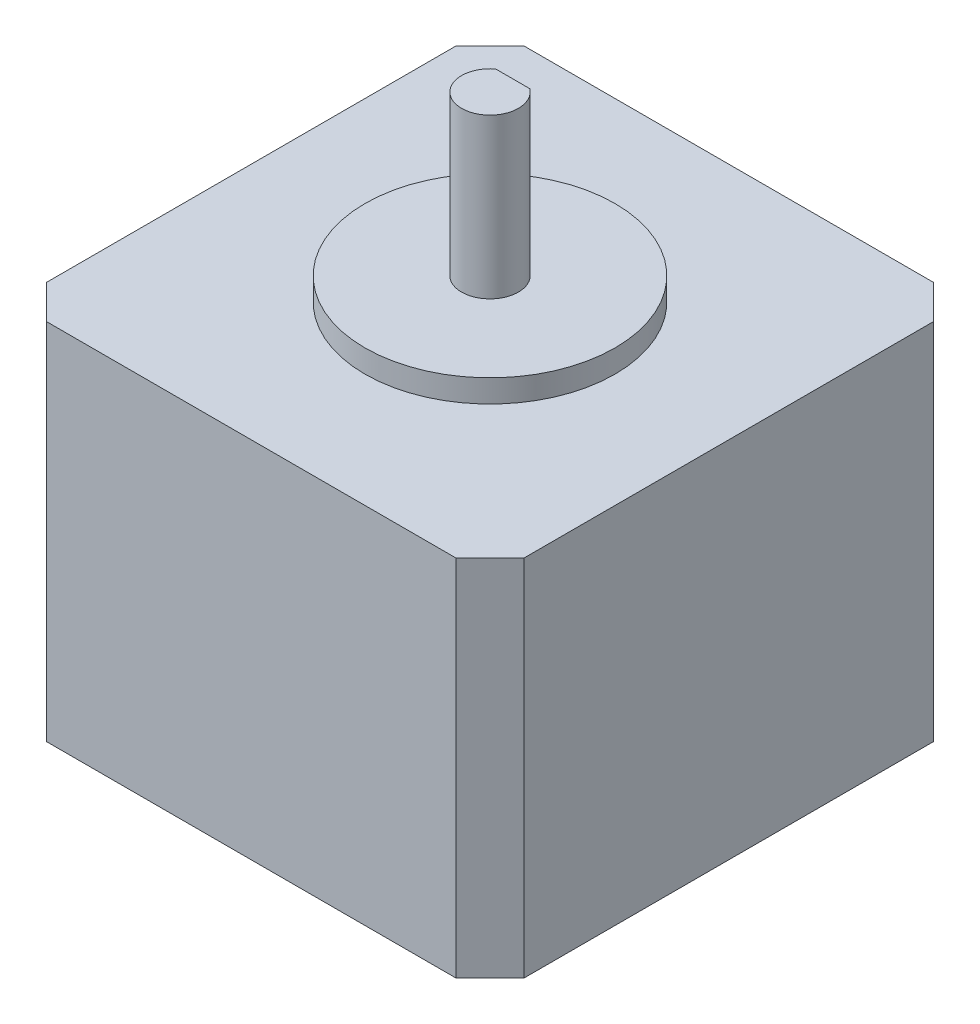
ISO-10303-21;
HEADER;
FILE_DESCRIPTION(('STEP AP214'),'2;1');
FILE_NAME('part.step','',(''),(''),'','','');
FILE_SCHEMA(('AUTOMOTIVE_DESIGN { 1 0 10303 214 1 1 1 1 }'));
ENDSEC;
DATA;
#1=APPLICATION_CONTEXT('core data for automotive mechanical design processes');
#2=APPLICATION_PROTOCOL_DEFINITION('international standard','automotive_design',2000,#1);
#3=PRODUCT_CONTEXT('',#1,'mechanical');
#4=PRODUCT('Part','Part','',(#3));
#5=PRODUCT_RELATED_PRODUCT_CATEGORY('part','',(#4));
#6=PRODUCT_DEFINITION_FORMATION('','',#4);
#7=PRODUCT_DEFINITION_CONTEXT('part definition',#1,'design');
#8=PRODUCT_DEFINITION('design','',#6,#7);
#9=PRODUCT_DEFINITION_SHAPE('','',#8);
#10=(LENGTH_UNIT() NAMED_UNIT(*) SI_UNIT(.MILLI.,.METRE.));
#11=(NAMED_UNIT(*) PLANE_ANGLE_UNIT() SI_UNIT($,.RADIAN.));
#12=(NAMED_UNIT(*) SI_UNIT($,.STERADIAN.) SOLID_ANGLE_UNIT());
#13=UNCERTAINTY_MEASURE_WITH_UNIT(LENGTH_MEASURE(1.E-05),#10,'distance_accuracy_value','');
#14=(GEOMETRIC_REPRESENTATION_CONTEXT(3) GLOBAL_UNCERTAINTY_ASSIGNED_CONTEXT((#13)) GLOBAL_UNIT_ASSIGNED_CONTEXT((#10,
#11,#12)) REPRESENTATION_CONTEXT('',''));
#15=CARTESIAN_POINT('',(0.,0.,0.));
#16=DIRECTION('',(0.,0.,1.));
#17=DIRECTION('',(1.,0.,0.));
#18=AXIS2_PLACEMENT_3D('',#15,#16,#17);
#19=CARTESIAN_POINT('',(0.,34.,0.));
#20=DIRECTION('',(0.,1.,0.));
#21=DIRECTION('',(0.,0.,1.));
#22=AXIS2_PLACEMENT_3D('',#19,#20,#21);
#23=PLANE('',#22);
#24=CARTESIAN_POINT('',(0.,34.,0.));
#25=DIRECTION('',(0.,1.,0.));
#26=DIRECTION('',(0.,0.,1.));
#27=AXIS2_PLACEMENT_3D('',#24,#25,#26);
#28=CIRCLE('',#27,11.);
#29=CARTESIAN_POINT('',(0.,34.,11.));
#30=VERTEX_POINT('',#29);
#31=EDGE_CURVE('E150',#30,#30,#28,.T.);
#32=ORIENTED_EDGE('',*,*,#31,.T.);
#33=EDGE_LOOP('',(#32));
#34=FACE_BOUND('',#33,.T.);
#35=DIRECTION('',(-1.,0.,0.));
#36=VECTOR('',#35,1.);
#37=CARTESIAN_POINT('',(-1.5,34.,-2.));
#38=LINE('',#37,#36);
#39=CARTESIAN_POINT('',(1.5,34.,-2.));
#40=VERTEX_POINT('',#39);
#41=CARTESIAN_POINT('',(-1.5,34.,-2.));
#42=VERTEX_POINT('',#41);
#43=EDGE_CURVE('E205',#40,#42,#38,.T.);
#44=ORIENTED_EDGE('',*,*,#43,.F.);
#45=CARTESIAN_POINT('',(0.,34.,0.));
#46=DIRECTION('',(0.,1.,0.));
#47=DIRECTION('',(0.,0.,1.));
#48=AXIS2_PLACEMENT_3D('',#45,#46,#47);
#49=CIRCLE('',#48,2.5);
#50=EDGE_CURVE('E51',#42,#40,#49,.T.);
#51=ORIENTED_EDGE('',*,*,#50,.F.);
#52=EDGE_LOOP('',(#44,#51));
#53=FACE_BOUND('',#52,.T.);
#54=ADVANCED_FACE('F36',(#34,#53),#23,.T.);
#55=CARTESIAN_POINT('',(0.,32.,0.));
#56=DIRECTION('',(0.,1.,0.));
#57=DIRECTION('',(0.,0.,1.));
#58=AXIS2_PLACEMENT_3D('',#55,#56,#57);
#59=PLANE('',#58);
#60=DIRECTION('',(-1.,0.,0.));
#61=VECTOR('',#60,1.);
#62=CARTESIAN_POINT('',(-18.,32.,-21.));
#63=LINE('',#62,#61);
#64=CARTESIAN_POINT('',(17.9999999999996,32.,-21.0000000000001));
#65=VERTEX_POINT('',#64);
#66=CARTESIAN_POINT('',(-18.,32.,-21.));
#67=VERTEX_POINT('',#66);
#68=EDGE_CURVE('E162',#65,#67,#63,.T.);
#69=ORIENTED_EDGE('',*,*,#68,.T.);
#70=DIRECTION('',(-0.707106781186548,0.,0.707106781186548));
#71=VECTOR('',#70,1.);
#72=CARTESIAN_POINT('',(-18.,32.,-21.));
#73=LINE('',#72,#71);
#74=CARTESIAN_POINT('',(-21.,32.,-18.));
#75=VERTEX_POINT('',#74);
#76=EDGE_CURVE('E101',#67,#75,#73,.T.);
#77=ORIENTED_EDGE('',*,*,#76,.T.);
#78=DIRECTION('',(0.,0.,1.));
#79=VECTOR('',#78,1.);
#80=CARTESIAN_POINT('',(-21.0000000000002,32.,17.9999999999998));
#81=LINE('',#80,#79);
#82=CARTESIAN_POINT('',(-21.0000000000002,32.,17.9999999999998));
#83=VERTEX_POINT('',#82);
#84=EDGE_CURVE('E177',#75,#83,#81,.T.);
#85=ORIENTED_EDGE('',*,*,#84,.T.);
#86=DIRECTION('',(0.70710678118654,0.,0.707106781186555));
#87=VECTOR('',#86,1.);
#88=CARTESIAN_POINT('',(-21.0000000000002,32.,17.9999999999998));
#89=LINE('',#88,#87);
#90=CARTESIAN_POINT('',(-18.0000000000002,32.,20.9999999999998));
#91=VERTEX_POINT('',#90);
#92=EDGE_CURVE('E189',#83,#91,#89,.T.);
#93=ORIENTED_EDGE('',*,*,#92,.T.);
#94=DIRECTION('',(1.,0.,0.));
#95=VECTOR('',#94,1.);
#96=CARTESIAN_POINT('',(-18.0000000000002,32.,20.9999999999998));
#97=LINE('',#96,#95);
#98=CARTESIAN_POINT('',(17.9999999999995,32.,20.9999999999999));
#99=VERTEX_POINT('',#98);
#100=EDGE_CURVE('E125',#91,#99,#97,.T.);
#101=ORIENTED_EDGE('',*,*,#100,.T.);
#102=DIRECTION('',(0.707106781186529,0.,-0.707106781186566));
#103=VECTOR('',#102,1.);
#104=CARTESIAN_POINT('',(17.9999999999995,32.,20.9999999999999));
#105=LINE('',#104,#103);
#106=CARTESIAN_POINT('',(20.9999999999997,32.,17.9999999999997));
#107=VERTEX_POINT('',#106);
#108=EDGE_CURVE('E117',#99,#107,#105,.T.);
#109=ORIENTED_EDGE('',*,*,#108,.T.);
#110=DIRECTION('',(0.,0.,-1.));
#111=VECTOR('',#110,1.);
#112=CARTESIAN_POINT('',(20.9999999999997,32.,17.9999999999997));
#113=LINE('',#112,#111);
#114=CARTESIAN_POINT('',(20.9999999999996,32.,-18.));
#115=VERTEX_POINT('',#114);
#116=EDGE_CURVE('E122',#107,#115,#113,.T.);
#117=ORIENTED_EDGE('',*,*,#116,.T.);
#118=DIRECTION('',(-0.70710678118654,0.,-0.707106781186555));
#119=VECTOR('',#118,1.);
#120=CARTESIAN_POINT('',(20.9999999999996,32.,-18.));
#121=LINE('',#120,#119);
#122=EDGE_CURVE('E60',#115,#65,#121,.T.);
#123=ORIENTED_EDGE('',*,*,#122,.T.);
#124=EDGE_LOOP('',(#69,#77,#85,#93,#101,#109,#117,#123));
#125=FACE_BOUND('',#124,.T.);
#126=CARTESIAN_POINT('',(0.,32.,0.));
#127=DIRECTION('',(0.,1.,0.));
#128=DIRECTION('',(0.,0.,1.));
#129=AXIS2_PLACEMENT_3D('',#126,#127,#128);
#130=CIRCLE('',#129,11.);
#131=CARTESIAN_POINT('',(0.,32.,11.));
#132=VERTEX_POINT('',#131);
#133=EDGE_CURVE('E195',#132,#132,#130,.T.);
#134=ORIENTED_EDGE('',*,*,#133,.F.);
#135=EDGE_LOOP('',(#134));
#136=FACE_BOUND('',#135,.T.);
#137=ADVANCED_FACE('F119',(#125,#136),#59,.T.);
#138=CARTESIAN_POINT('',(-18.,32.,-21.));
#139=DIRECTION('',(0.,0.,1.));
#140=DIRECTION('',(1.,0.,0.));
#141=AXIS2_PLACEMENT_3D('',#138,#139,#140);
#142=PLANE('',#141);
#143=DIRECTION('',(-1.,0.,0.));
#144=VECTOR('',#143,1.);
#145=CARTESIAN_POINT('',(-18.,0.,-21.));
#146=LINE('',#145,#144);
#147=CARTESIAN_POINT('',(17.9999999999996,0.,-21.0000000000001));
#148=VERTEX_POINT('',#147);
#149=CARTESIAN_POINT('',(-18.,0.,-21.));
#150=VERTEX_POINT('',#149);
#151=EDGE_CURVE('E146',#148,#150,#146,.T.);
#152=ORIENTED_EDGE('',*,*,#151,.T.);
#153=DIRECTION('',(0.,-1.,0.));
#154=VECTOR('',#153,1.);
#155=CARTESIAN_POINT('',(-18.,32.,-21.));
#156=LINE('',#155,#154);
#157=EDGE_CURVE('E11',#67,#150,#156,.T.);
#158=ORIENTED_EDGE('',*,*,#157,.F.);
#159=ORIENTED_EDGE('',*,*,#68,.F.);
#160=DIRECTION('',(0.,-1.,0.));
#161=VECTOR('',#160,1.);
#162=CARTESIAN_POINT('',(17.9999999999996,32.,-21.0000000000001));
#163=LINE('',#162,#161);
#164=EDGE_CURVE('E142',#65,#148,#163,.T.);
#165=ORIENTED_EDGE('',*,*,#164,.T.);
#166=EDGE_LOOP('',(#152,#158,#159,#165));
#167=FACE_BOUND('',#166,.T.);
#168=ADVANCED_FACE('F38',(#167),#142,.F.);
#169=CARTESIAN_POINT('',(-18.,32.,-21.));
#170=DIRECTION('',(0.707106781186547,0.,0.707106781186547));
#171=DIRECTION('',(0.707106781186548,0.,-0.707106781186548));
#172=AXIS2_PLACEMENT_3D('',#169,#170,#171);
#173=PLANE('',#172);
#174=DIRECTION('',(-0.707106781186548,0.,0.707106781186548));
#175=VECTOR('',#174,1.);
#176=CARTESIAN_POINT('',(-18.,0.,-21.));
#177=LINE('',#176,#175);
#178=CARTESIAN_POINT('',(-21.,0.,-18.));
#179=VERTEX_POINT('',#178);
#180=EDGE_CURVE('E149',#150,#179,#177,.T.);
#181=ORIENTED_EDGE('',*,*,#180,.T.);
#182=DIRECTION('',(0.,-1.,0.));
#183=VECTOR('',#182,1.);
#184=CARTESIAN_POINT('',(-21.,32.,-18.));
#185=LINE('',#184,#183);
#186=EDGE_CURVE('E44',#75,#179,#185,.T.);
#187=ORIENTED_EDGE('',*,*,#186,.F.);
#188=ORIENTED_EDGE('',*,*,#76,.F.);
#189=ORIENTED_EDGE('',*,*,#157,.T.);
#190=EDGE_LOOP('',(#181,#187,#188,#189));
#191=FACE_BOUND('',#190,.T.);
#192=ADVANCED_FACE('F253',(#191),#173,.F.);
#193=CARTESIAN_POINT('',(-21.0000000000002,32.,17.9999999999998));
#194=DIRECTION('',(1.,0.,0.));
#195=DIRECTION('',(0.,0.,-1.));
#196=AXIS2_PLACEMENT_3D('',#193,#194,#195);
#197=PLANE('',#196);
#198=DIRECTION('',(0.,0.,1.));
#199=VECTOR('',#198,1.);
#200=CARTESIAN_POINT('',(-21.0000000000002,0.,17.9999999999998));
#201=LINE('',#200,#199);
#202=CARTESIAN_POINT('',(-21.0000000000002,0.,17.9999999999998));
#203=VERTEX_POINT('',#202);
#204=EDGE_CURVE('E152',#179,#203,#201,.T.);
#205=ORIENTED_EDGE('',*,*,#204,.T.);
#206=DIRECTION('',(0.,-1.,0.));
#207=VECTOR('',#206,1.);
#208=CARTESIAN_POINT('',(-21.0000000000002,32.,17.9999999999998));
#209=LINE('',#208,#207);
#210=EDGE_CURVE('E169',#83,#203,#209,.T.);
#211=ORIENTED_EDGE('',*,*,#210,.F.);
#212=ORIENTED_EDGE('',*,*,#84,.F.);
#213=ORIENTED_EDGE('',*,*,#186,.T.);
#214=EDGE_LOOP('',(#205,#211,#212,#213));
#215=FACE_BOUND('',#214,.T.);
#216=ADVANCED_FACE('F175',(#215),#197,.F.);
#217=CARTESIAN_POINT('',(-21.0000000000002,32.,17.9999999999998));
#218=DIRECTION('',(0.707106781186555,0.,-0.70710678118654));
#219=DIRECTION('',(-0.70710678118654,0.,-0.707106781186555));
#220=AXIS2_PLACEMENT_3D('',#217,#218,#219);
#221=PLANE('',#220);
#222=DIRECTION('',(0.70710678118654,0.,0.707106781186555));
#223=VECTOR('',#222,1.);
#224=CARTESIAN_POINT('',(-21.0000000000002,0.,17.9999999999998));
#225=LINE('',#224,#223);
#226=CARTESIAN_POINT('',(-18.0000000000002,0.,20.9999999999998));
#227=VERTEX_POINT('',#226);
#228=EDGE_CURVE('E154',#203,#227,#225,.T.);
#229=ORIENTED_EDGE('',*,*,#228,.T.);
#230=DIRECTION('',(0.,-1.,0.));
#231=VECTOR('',#230,1.);
#232=CARTESIAN_POINT('',(-18.0000000000002,32.,20.9999999999998));
#233=LINE('',#232,#231);
#234=EDGE_CURVE('E166',#91,#227,#233,.T.);
#235=ORIENTED_EDGE('',*,*,#234,.F.);
#236=ORIENTED_EDGE('',*,*,#92,.F.);
#237=ORIENTED_EDGE('',*,*,#210,.T.);
#238=EDGE_LOOP('',(#229,#235,#236,#237));
#239=FACE_BOUND('',#238,.T.);
#240=ADVANCED_FACE('F185',(#239),#221,.F.);
#241=CARTESIAN_POINT('',(-18.0000000000002,32.,20.9999999999998));
#242=DIRECTION('',(0.,0.,-1.));
#243=DIRECTION('',(-1.,0.,0.));
#244=AXIS2_PLACEMENT_3D('',#241,#242,#243);
#245=PLANE('',#244);
#246=DIRECTION('',(1.,0.,0.));
#247=VECTOR('',#246,1.);
#248=CARTESIAN_POINT('',(-18.0000000000002,0.,20.9999999999998));
#249=LINE('',#248,#247);
#250=CARTESIAN_POINT('',(17.9999999999995,0.,20.9999999999999));
#251=VERTEX_POINT('',#250);
#252=EDGE_CURVE('E156',#227,#251,#249,.T.);
#253=ORIENTED_EDGE('',*,*,#252,.T.);
#254=DIRECTION('',(0.,-1.,0.));
#255=VECTOR('',#254,1.);
#256=CARTESIAN_POINT('',(17.9999999999995,32.,20.9999999999999));
#257=LINE('',#256,#255);
#258=EDGE_CURVE('E137',#99,#251,#257,.T.);
#259=ORIENTED_EDGE('',*,*,#258,.F.);
#260=ORIENTED_EDGE('',*,*,#100,.F.);
#261=ORIENTED_EDGE('',*,*,#234,.T.);
#262=EDGE_LOOP('',(#253,#259,#260,#261));
#263=FACE_BOUND('',#262,.T.);
#264=ADVANCED_FACE('F188',(#263),#245,.F.);
#265=CARTESIAN_POINT('',(17.9999999999995,32.,20.9999999999999));
#266=DIRECTION('',(-0.707106781186566,0.,-0.707106781186529));
#267=DIRECTION('',(-0.707106781186529,0.,0.707106781186566));
#268=AXIS2_PLACEMENT_3D('',#265,#266,#267);
#269=PLANE('',#268);
#270=DIRECTION('',(0.707106781186529,0.,-0.707106781186566));
#271=VECTOR('',#270,1.);
#272=CARTESIAN_POINT('',(17.9999999999995,0.,20.9999999999999));
#273=LINE('',#272,#271);
#274=CARTESIAN_POINT('',(20.9999999999997,0.,17.9999999999997));
#275=VERTEX_POINT('',#274);
#276=EDGE_CURVE('E134',#251,#275,#273,.T.);
#277=ORIENTED_EDGE('',*,*,#276,.T.);
#278=DIRECTION('',(0.,-1.,0.));
#279=VECTOR('',#278,1.);
#280=CARTESIAN_POINT('',(20.9999999999997,32.,17.9999999999997));
#281=LINE('',#280,#279);
#282=EDGE_CURVE('E131',#107,#275,#281,.T.);
#283=ORIENTED_EDGE('',*,*,#282,.F.);
#284=ORIENTED_EDGE('',*,*,#108,.F.);
#285=ORIENTED_EDGE('',*,*,#258,.T.);
#286=EDGE_LOOP('',(#277,#283,#284,#285));
#287=FACE_BOUND('',#286,.T.);
#288=ADVANCED_FACE('F132',(#287),#269,.F.);
#289=CARTESIAN_POINT('',(20.9999999999997,32.,17.9999999999997));
#290=DIRECTION('',(-1.,0.,0.));
#291=DIRECTION('',(0.,0.,1.));
#292=AXIS2_PLACEMENT_3D('',#289,#290,#291);
#293=PLANE('',#292);
#294=DIRECTION('',(0.,0.,-1.));
#295=VECTOR('',#294,1.);
#296=CARTESIAN_POINT('',(20.9999999999997,0.,17.9999999999997));
#297=LINE('',#296,#295);
#298=CARTESIAN_POINT('',(20.9999999999996,0.,-18.));
#299=VERTEX_POINT('',#298);
#300=EDGE_CURVE('E159',#275,#299,#297,.T.);
#301=ORIENTED_EDGE('',*,*,#300,.T.);
#302=DIRECTION('',(0.,-1.,0.));
#303=VECTOR('',#302,1.);
#304=CARTESIAN_POINT('',(20.9999999999996,32.,-18.));
#305=LINE('',#304,#303);
#306=EDGE_CURVE('E138',#115,#299,#305,.T.);
#307=ORIENTED_EDGE('',*,*,#306,.F.);
#308=ORIENTED_EDGE('',*,*,#116,.F.);
#309=ORIENTED_EDGE('',*,*,#282,.T.);
#310=EDGE_LOOP('',(#301,#307,#308,#309));
#311=FACE_BOUND('',#310,.T.);
#312=ADVANCED_FACE('F140',(#311),#293,.F.);
#313=CARTESIAN_POINT('',(20.9999999999996,32.,-18.));
#314=DIRECTION('',(-0.707106781186555,0.,0.70710678118654));
#315=DIRECTION('',(0.70710678118654,0.,0.707106781186555));
#316=AXIS2_PLACEMENT_3D('',#313,#314,#315);
#317=PLANE('',#316);
#318=DIRECTION('',(-0.70710678118654,0.,-0.707106781186555));
#319=VECTOR('',#318,1.);
#320=CARTESIAN_POINT('',(20.9999999999996,0.,-18.));
#321=LINE('',#320,#319);
#322=EDGE_CURVE('E93',#299,#148,#321,.T.);
#323=ORIENTED_EDGE('',*,*,#322,.T.);
#324=ORIENTED_EDGE('',*,*,#164,.F.);
#325=ORIENTED_EDGE('',*,*,#122,.F.);
#326=ORIENTED_EDGE('',*,*,#306,.T.);
#327=EDGE_LOOP('',(#323,#324,#325,#326));
#328=FACE_BOUND('',#327,.T.);
#329=ADVANCED_FACE('F241',(#328),#317,.F.);
#330=CARTESIAN_POINT('',(0.,0.,0.));
#331=DIRECTION('',(0.,1.,0.));
#332=DIRECTION('',(0.,0.,1.));
#333=AXIS2_PLACEMENT_3D('',#330,#331,#332);
#334=PLANE('',#333);
#335=ORIENTED_EDGE('',*,*,#151,.F.);
#336=ORIENTED_EDGE('',*,*,#322,.F.);
#337=ORIENTED_EDGE('',*,*,#300,.F.);
#338=ORIENTED_EDGE('',*,*,#276,.F.);
#339=ORIENTED_EDGE('',*,*,#252,.F.);
#340=ORIENTED_EDGE('',*,*,#228,.F.);
#341=ORIENTED_EDGE('',*,*,#204,.F.);
#342=ORIENTED_EDGE('',*,*,#180,.F.);
#343=EDGE_LOOP('',(#335,#336,#337,#338,#339,#340,#341,#342));
#344=FACE_BOUND('',#343,.T.);
#345=ADVANCED_FACE('F181',(#344),#334,.F.);
#346=CARTESIAN_POINT('',(0.,34.,0.));
#347=DIRECTION('',(0.,-1.,0.));
#348=DIRECTION('',(0.,0.,-1.));
#349=AXIS2_PLACEMENT_3D('',#346,#347,#348);
#350=CYLINDRICAL_SURFACE('',#349,11.);
#351=ORIENTED_EDGE('',*,*,#31,.F.);
#352=EDGE_LOOP('',(#351));
#353=FACE_BOUND('',#352,.T.);
#354=ORIENTED_EDGE('',*,*,#133,.T.);
#355=EDGE_LOOP('',(#354));
#356=FACE_BOUND('',#355,.T.);
#357=ADVANCED_FACE('F235',(#353,#356),#350,.T.);
#358=CARTESIAN_POINT('',(0.,48.,0.));
#359=DIRECTION('',(0.,-1.,0.));
#360=DIRECTION('',(0.,0.,-1.));
#361=AXIS2_PLACEMENT_3D('',#358,#359,#360);
#362=CYLINDRICAL_SURFACE('',#361,2.5);
#363=ORIENTED_EDGE('',*,*,#50,.T.);
#364=DIRECTION('',(0.,-1.,0.));
#365=VECTOR('',#364,1.);
#366=CARTESIAN_POINT('',(1.5,48.,-2.));
#367=LINE('',#366,#365);
#368=CARTESIAN_POINT('',(1.5,48.,-2.));
#369=VERTEX_POINT('',#368);
#370=EDGE_CURVE('E198',#369,#40,#367,.T.);
#371=ORIENTED_EDGE('',*,*,#370,.F.);
#372=CARTESIAN_POINT('',(0.,48.,0.));
#373=DIRECTION('',(0.,1.,0.));
#374=DIRECTION('',(0.,0.,1.));
#375=AXIS2_PLACEMENT_3D('',#372,#373,#374);
#376=CIRCLE('',#375,2.5);
#377=CARTESIAN_POINT('',(-1.5,48.,-2.));
#378=VERTEX_POINT('',#377);
#379=EDGE_CURVE('E208',#378,#369,#376,.T.);
#380=ORIENTED_EDGE('',*,*,#379,.F.);
#381=DIRECTION('',(0.,-1.,0.));
#382=VECTOR('',#381,1.);
#383=CARTESIAN_POINT('',(-1.5,48.,-2.));
#384=LINE('',#383,#382);
#385=EDGE_CURVE('E202',#378,#42,#384,.T.);
#386=ORIENTED_EDGE('',*,*,#385,.T.);
#387=EDGE_LOOP('',(#363,#371,#380,#386));
#388=FACE_BOUND('',#387,.T.);
#389=ADVANCED_FACE('F220',(#388),#362,.T.);
#390=CARTESIAN_POINT('',(-1.5,48.,-2.));
#391=DIRECTION('',(0.,0.,1.));
#392=DIRECTION('',(1.,0.,0.));
#393=AXIS2_PLACEMENT_3D('',#390,#391,#392);
#394=PLANE('',#393);
#395=ORIENTED_EDGE('',*,*,#43,.T.);
#396=ORIENTED_EDGE('',*,*,#385,.F.);
#397=DIRECTION('',(-1.,0.,0.));
#398=VECTOR('',#397,1.);
#399=CARTESIAN_POINT('',(-1.5,48.,-2.));
#400=LINE('',#399,#398);
#401=EDGE_CURVE('E204',#369,#378,#400,.T.);
#402=ORIENTED_EDGE('',*,*,#401,.F.);
#403=ORIENTED_EDGE('',*,*,#370,.T.);
#404=EDGE_LOOP('',(#395,#396,#402,#403));
#405=FACE_BOUND('',#404,.T.);
#406=ADVANCED_FACE('F223',(#405),#394,.F.);
#407=CARTESIAN_POINT('',(0.,48.,0.));
#408=DIRECTION('',(0.,1.,0.));
#409=DIRECTION('',(0.,0.,1.));
#410=AXIS2_PLACEMENT_3D('',#407,#408,#409);
#411=PLANE('',#410);
#412=ORIENTED_EDGE('',*,*,#379,.T.);
#413=ORIENTED_EDGE('',*,*,#401,.T.);
#414=EDGE_LOOP('',(#412,#413));
#415=FACE_BOUND('',#414,.T.);
#416=ADVANCED_FACE('F216',(#415),#411,.T.);
#417=CLOSED_SHELL('',(#54,#137,#168,#192,#216,#240,#264,#288,#312,#329,#345,#357,#389,#406,#416));
#418=MANIFOLD_SOLID_BREP('B2',#417);
#419=ADVANCED_BREP_SHAPE_REPRESENTATION('',(#18,#418),#14);
#420=SHAPE_DEFINITION_REPRESENTATION(#9,#419);
ENDSEC;
END-ISO-10303-21;
